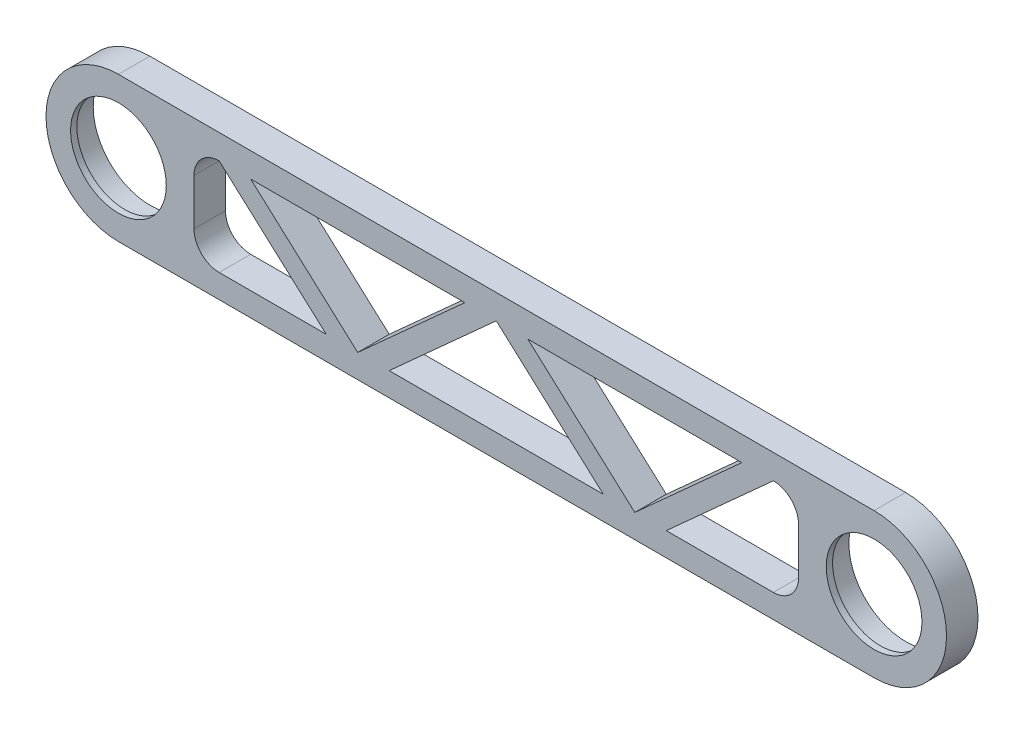
ISO-10303-21;
HEADER;
FILE_DESCRIPTION(('STEP AP214'),'2;1');
FILE_NAME('part.step','',(''),(''),'','','');
FILE_SCHEMA(('AUTOMOTIVE_DESIGN { 1 0 10303 214 1 1 1 1 }'));
ENDSEC;
DATA;
#1=APPLICATION_CONTEXT('core data for automotive mechanical design processes');
#2=APPLICATION_PROTOCOL_DEFINITION('international standard','automotive_design',2000,#1);
#3=PRODUCT_CONTEXT('',#1,'mechanical');
#4=PRODUCT('Part','Part','',(#3));
#5=PRODUCT_RELATED_PRODUCT_CATEGORY('part','',(#4));
#6=PRODUCT_DEFINITION_FORMATION('','',#4);
#7=PRODUCT_DEFINITION_CONTEXT('part definition',#1,'design');
#8=PRODUCT_DEFINITION('design','',#6,#7);
#9=PRODUCT_DEFINITION_SHAPE('','',#8);
#10=(LENGTH_UNIT() NAMED_UNIT(*) SI_UNIT(.MILLI.,.METRE.));
#11=(NAMED_UNIT(*) PLANE_ANGLE_UNIT() SI_UNIT($,.RADIAN.));
#12=(NAMED_UNIT(*) SI_UNIT($,.STERADIAN.) SOLID_ANGLE_UNIT());
#13=UNCERTAINTY_MEASURE_WITH_UNIT(LENGTH_MEASURE(1.E-05),#10,'distance_accuracy_value','');
#14=(GEOMETRIC_REPRESENTATION_CONTEXT(3) GLOBAL_UNCERTAINTY_ASSIGNED_CONTEXT((#13)) GLOBAL_UNIT_ASSIGNED_CONTEXT((#10,
#11,#12)) REPRESENTATION_CONTEXT('',''));
#15=CARTESIAN_POINT('',(0.,0.,0.));
#16=DIRECTION('',(0.,0.,1.));
#17=DIRECTION('',(1.,0.,0.));
#18=AXIS2_PLACEMENT_3D('',#15,#16,#17);
#19=CARTESIAN_POINT('',(0.,0.,5.));
#20=DIRECTION('',(0.,0.,1.));
#21=DIRECTION('',(1.,0.,0.));
#22=AXIS2_PLACEMENT_3D('',#19,#20,#21);
#23=PLANE('',#22);
#24=DIRECTION('',(0.742231284401253,0.670143805802954,0.));
#25=VECTOR('',#24,1.);
#26=CARTESIAN_POINT('',(40.6799264225191,-45.0558727492184,5.));
#27=LINE('',#26,#25);
#28=CARTESIAN_POINT('',(82.,-7.74891473597792,5.));
#29=VERTEX_POINT('',#28);
#30=CARTESIAN_POINT('',(99.,7.6,5.));
#31=VERTEX_POINT('',#30);
#32=EDGE_CURVE('E250',#29,#31,#27,.T.);
#33=ORIENTED_EDGE('',*,*,#32,.F.);
#34=DIRECTION('',(0.742231284401253,-0.670143805802954,0.));
#35=VECTOR('',#34,1.);
#36=CARTESIAN_POINT('',(32.9712797322758,36.5180056759874,5.));
#37=LINE('',#36,#35);
#38=CARTESIAN_POINT('',(65.,7.6,5.));
#39=VERTEX_POINT('',#38);
#40=EDGE_CURVE('E262',#39,#29,#37,.T.);
#41=ORIENTED_EDGE('',*,*,#40,.F.);
#42=DIRECTION('',(1.,0.,0.));
#43=VECTOR('',#42,1.);
#44=CARTESIAN_POINT('',(16.,7.6,5.));
#45=LINE('',#44,#43);
#46=EDGE_CURVE('E328',#39,#31,#45,.T.);
#47=ORIENTED_EDGE('',*,*,#46,.T.);
#48=EDGE_LOOP('',(#33,#41,#47));
#49=FACE_BOUND('',#48,.T.);
#50=DIRECTION('',(1.,0.,0.));
#51=VECTOR('',#50,1.);
#52=CARTESIAN_POINT('',(16.,-7.74891473597794,5.));
#53=LINE('',#52,#51);
#54=CARTESIAN_POINT('',(43.,-7.74891473597793,5.));
#55=VERTEX_POINT('',#54);
#56=CARTESIAN_POINT('',(77.,-7.74891473597793,5.));
#57=VERTEX_POINT('',#56);
#58=EDGE_CURVE('E325',#55,#57,#53,.T.);
#59=ORIENTED_EDGE('',*,*,#58,.F.);
#60=DIRECTION('',(0.742231284401253,0.670143805802954,0.));
#61=VECTOR('',#60,1.);
#62=CARTESIAN_POINT('',(23.1653103247325,-25.6572065383463,5.));
#63=LINE('',#62,#61);
#64=CARTESIAN_POINT('',(60.,7.6,5.));
#65=VERTEX_POINT('',#64);
#66=EDGE_CURVE('E291',#55,#65,#63,.T.);
#67=ORIENTED_EDGE('',*,*,#66,.T.);
#68=DIRECTION('',(0.742231284401253,-0.670143805802954,0.));
#69=VECTOR('',#68,1.);
#70=CARTESIAN_POINT('',(30.7258161299955,34.0309971874141,5.));
#71=LINE('',#70,#69);
#72=EDGE_CURVE('E272',#65,#57,#71,.T.);
#73=ORIENTED_EDGE('',*,*,#72,.T.);
#74=EDGE_LOOP('',(#59,#67,#73));
#75=FACE_BOUND('',#74,.T.);
#76=DIRECTION('',(0.742231284401253,-0.670143805802954,0.));
#77=VECTOR('',#76,1.);
#78=CARTESIAN_POINT('',(13.2112000322089,14.632330976542,5.));
#79=LINE('',#78,#77);
#80=CARTESIAN_POINT('',(21.,7.6,5.));
#81=VERTEX_POINT('',#80);
#82=CARTESIAN_POINT('',(38.,-7.74891473597793,5.));
#83=VERTEX_POINT('',#82);
#84=EDGE_CURVE('E303',#81,#83,#79,.T.);
#85=ORIENTED_EDGE('',*,*,#84,.F.);
#86=CARTESIAN_POINT('',(55.,7.6,5.));
#87=VERTEX_POINT('',#86);
#88=EDGE_CURVE('E329',#81,#87,#45,.T.);
#89=ORIENTED_EDGE('',*,*,#88,.T.);
#90=DIRECTION('',(0.742231284401253,0.670143805802954,0.));
#91=VECTOR('',#90,1.);
#92=CARTESIAN_POINT('',(20.9198467224522,-23.170198049773,5.));
#93=LINE('',#92,#91);
#94=EDGE_CURVE('E281',#83,#87,#93,.T.);
#95=ORIENTED_EDGE('',*,*,#94,.F.);
#96=EDGE_LOOP('',(#85,#89,#95));
#97=FACE_BOUND('',#96,.T.);
#98=CARTESIAN_POINT('',(16.,3.6,5.));
#99=DIRECTION('',(0.,0.,1.));
#100=DIRECTION('',(1.,0.,0.));
#101=AXIS2_PLACEMENT_3D('',#98,#99,#100);
#102=CIRCLE('',#101,4.);
#103=CARTESIAN_POINT('',(16.,7.6,5.));
#104=VERTEX_POINT('',#103);
#105=CARTESIAN_POINT('',(12.,3.6,5.));
#106=VERTEX_POINT('',#105);
#107=EDGE_CURVE('E312',#104,#106,#102,.T.);
#108=ORIENTED_EDGE('',*,*,#107,.F.);
#109=DIRECTION('',(0.742231284401253,-0.670143805802954,0.));
#110=VECTOR('',#109,1.);
#111=CARTESIAN_POINT('',(10.9657364299286,12.1453224879686,5.));
#112=LINE('',#111,#110);
#113=CARTESIAN_POINT('',(33.,-7.74891473597794,5.));
#114=VERTEX_POINT('',#113);
#115=EDGE_CURVE('E294',#104,#114,#112,.T.);
#116=ORIENTED_EDGE('',*,*,#115,.T.);
#117=CARTESIAN_POINT('',(16.,-7.74891473597794,5.));
#118=VERTEX_POINT('',#117);
#119=EDGE_CURVE('E326',#118,#114,#53,.T.);
#120=ORIENTED_EDGE('',*,*,#119,.F.);
#121=CARTESIAN_POINT('',(16.,-3.74891473597794,5.));
#122=DIRECTION('',(0.,0.,1.));
#123=DIRECTION('',(1.,0.,0.));
#124=AXIS2_PLACEMENT_3D('',#121,#122,#123);
#125=CIRCLE('',#124,4.);
#126=CARTESIAN_POINT('',(12.,-3.74891473597794,5.));
#127=VERTEX_POINT('',#126);
#128=EDGE_CURVE('E322',#127,#118,#125,.T.);
#129=ORIENTED_EDGE('',*,*,#128,.F.);
#130=DIRECTION('',(0.,-1.,0.));
#131=VECTOR('',#130,1.);
#132=CARTESIAN_POINT('',(12.,3.6,5.));
#133=LINE('',#132,#131);
#134=EDGE_CURVE('E319',#106,#127,#133,.T.);
#135=ORIENTED_EDGE('',*,*,#134,.F.);
#136=EDGE_LOOP('',(#108,#116,#120,#129,#135));
#137=FACE_BOUND('',#136,.T.);
#138=CARTESIAN_POINT('',(120.,0.,5.));
#139=DIRECTION('',(0.,0.,1.));
#140=DIRECTION('',(1.,0.,0.));
#141=AXIS2_PLACEMENT_3D('',#138,#139,#140);
#142=CIRCLE('',#141,7.60000000000001);
#143=CARTESIAN_POINT('',(127.6,0.,5.));
#144=VERTEX_POINT('',#143);
#145=EDGE_CURVE('E345',#144,#144,#142,.T.);
#146=ORIENTED_EDGE('',*,*,#145,.F.);
#147=EDGE_LOOP('',(#146));
#148=FACE_BOUND('',#147,.T.);
#149=CARTESIAN_POINT('',(0.,0.,5.));
#150=DIRECTION('',(0.,0.,1.));
#151=DIRECTION('',(1.,0.,0.));
#152=AXIS2_PLACEMENT_3D('',#149,#150,#151);
#153=CIRCLE('',#152,7.6);
#154=CARTESIAN_POINT('',(7.6,0.,5.));
#155=VERTEX_POINT('',#154);
#156=EDGE_CURVE('E355',#155,#155,#153,.T.);
#157=ORIENTED_EDGE('',*,*,#156,.F.);
#158=EDGE_LOOP('',(#157));
#159=FACE_BOUND('',#158,.T.);
#160=CARTESIAN_POINT('',(0.,0.,5.));
#161=DIRECTION('',(0.,0.,1.));
#162=DIRECTION('',(1.,0.,0.));
#163=AXIS2_PLACEMENT_3D('',#160,#161,#162);
#164=CIRCLE('',#163,11.5);
#165=CARTESIAN_POINT('',(0.,11.5,5.));
#166=VERTEX_POINT('',#165);
#167=CARTESIAN_POINT('',(0.,-11.5,5.));
#168=VERTEX_POINT('',#167);
#169=EDGE_CURVE('E363',#166,#168,#164,.T.);
#170=ORIENTED_EDGE('',*,*,#169,.T.);
#171=DIRECTION('',(1.,0.,0.));
#172=VECTOR('',#171,1.);
#173=CARTESIAN_POINT('',(0.,-11.5,5.));
#174=LINE('',#173,#172);
#175=CARTESIAN_POINT('',(120.,-11.5,5.));
#176=VERTEX_POINT('',#175);
#177=EDGE_CURVE('E366',#168,#176,#174,.T.);
#178=ORIENTED_EDGE('',*,*,#177,.T.);
#179=CARTESIAN_POINT('',(120.,0.,5.));
#180=DIRECTION('',(0.,0.,1.));
#181=DIRECTION('',(1.,0.,0.));
#182=AXIS2_PLACEMENT_3D('',#179,#180,#181);
#183=CIRCLE('',#182,11.5);
#184=CARTESIAN_POINT('',(120.,11.5,5.));
#185=VERTEX_POINT('',#184);
#186=EDGE_CURVE('E369',#176,#185,#183,.T.);
#187=ORIENTED_EDGE('',*,*,#186,.T.);
#188=DIRECTION('',(-1.,0.,0.));
#189=VECTOR('',#188,1.);
#190=CARTESIAN_POINT('',(0.,11.5,5.));
#191=LINE('',#190,#189);
#192=EDGE_CURVE('E371',#185,#166,#191,.T.);
#193=ORIENTED_EDGE('',*,*,#192,.T.);
#194=EDGE_LOOP('',(#170,#178,#187,#193));
#195=FACE_BOUND('',#194,.T.);
#196=DIRECTION('',(0.742231284401253,0.670143805802953,0.));
#197=VECTOR('',#196,1.);
#198=CARTESIAN_POINT('',(42.9253900247994,-47.5428812377918,5.));
#199=LINE('',#198,#197);
#200=CARTESIAN_POINT('',(87.,-7.74891473597792,5.));
#201=VERTEX_POINT('',#200);
#202=CARTESIAN_POINT('',(104.,7.59999999999998,5.));
#203=VERTEX_POINT('',#202);
#204=EDGE_CURVE('E235',#201,#203,#199,.T.);
#205=ORIENTED_EDGE('',*,*,#204,.T.);
#206=CARTESIAN_POINT('',(104.,3.6,5.));
#207=DIRECTION('',(0.,0.,1.));
#208=DIRECTION('',(1.,0.,0.));
#209=AXIS2_PLACEMENT_3D('',#206,#207,#208);
#210=CIRCLE('',#209,3.99999999999999);
#211=CARTESIAN_POINT('',(108.,3.6,5.));
#212=VERTEX_POINT('',#211);
#213=EDGE_CURVE('E84',#203,#212,#210,.F.);
#214=ORIENTED_EDGE('',*,*,#213,.T.);
#215=DIRECTION('',(0.,-1.,0.));
#216=VECTOR('',#215,1.);
#217=CARTESIAN_POINT('',(108.,0.,5.));
#218=LINE('',#217,#216);
#219=CARTESIAN_POINT('',(108.,-3.74891473597792,5.));
#220=VERTEX_POINT('',#219);
#221=EDGE_CURVE('E243',#212,#220,#218,.T.);
#222=ORIENTED_EDGE('',*,*,#221,.T.);
#223=CARTESIAN_POINT('',(104.,-3.74891473597792,5.));
#224=DIRECTION('',(0.,0.,1.));
#225=DIRECTION('',(1.,0.,0.));
#226=AXIS2_PLACEMENT_3D('',#223,#224,#225);
#227=CIRCLE('',#226,4.);
#228=CARTESIAN_POINT('',(104.,-7.74891473597792,5.));
#229=VERTEX_POINT('',#228);
#230=EDGE_CURVE('E241',#229,#220,#227,.T.);
#231=ORIENTED_EDGE('',*,*,#230,.F.);
#232=DIRECTION('',(1.,0.,0.));
#233=VECTOR('',#232,1.);
#234=CARTESIAN_POINT('',(0.,-7.74891473597795,5.));
#235=LINE('',#234,#233);
#236=EDGE_CURVE('E226',#201,#229,#235,.T.);
#237=ORIENTED_EDGE('',*,*,#236,.F.);
#238=EDGE_LOOP('',(#205,#214,#222,#231,#237));
#239=FACE_BOUND('',#238,.T.);
#240=ADVANCED_FACE('F69',(#49,#75,#97,#137,#148,#159,#195,#239),#23,.T.);
#241=CARTESIAN_POINT('',(0.,0.,0.));
#242=DIRECTION('',(0.,0.,1.));
#243=DIRECTION('',(1.,0.,0.));
#244=AXIS2_PLACEMENT_3D('',#241,#242,#243);
#245=PLANE('',#244);
#246=CARTESIAN_POINT('',(0.,0.,0.));
#247=DIRECTION('',(0.,0.,1.));
#248=DIRECTION('',(1.,0.,0.));
#249=AXIS2_PLACEMENT_3D('',#246,#247,#248);
#250=CIRCLE('',#249,11.5);
#251=CARTESIAN_POINT('',(0.,11.5,0.));
#252=VERTEX_POINT('',#251);
#253=CARTESIAN_POINT('',(0.,-11.5,0.));
#254=VERTEX_POINT('',#253);
#255=EDGE_CURVE('E359',#252,#254,#250,.T.);
#256=ORIENTED_EDGE('',*,*,#255,.F.);
#257=DIRECTION('',(-1.,0.,0.));
#258=VECTOR('',#257,1.);
#259=CARTESIAN_POINT('',(0.,11.5,0.));
#260=LINE('',#259,#258);
#261=CARTESIAN_POINT('',(120.,11.5,0.));
#262=VERTEX_POINT('',#261);
#263=EDGE_CURVE('E367',#262,#252,#260,.T.);
#264=ORIENTED_EDGE('',*,*,#263,.F.);
#265=CARTESIAN_POINT('',(120.,0.,0.));
#266=DIRECTION('',(0.,0.,1.));
#267=DIRECTION('',(1.,0.,0.));
#268=AXIS2_PLACEMENT_3D('',#265,#266,#267);
#269=CIRCLE('',#268,11.5);
#270=CARTESIAN_POINT('',(120.,-11.5,0.));
#271=VERTEX_POINT('',#270);
#272=EDGE_CURVE('E378',#271,#262,#269,.T.);
#273=ORIENTED_EDGE('',*,*,#272,.F.);
#274=DIRECTION('',(1.,0.,0.));
#275=VECTOR('',#274,1.);
#276=CARTESIAN_POINT('',(0.,-11.5,0.));
#277=LINE('',#276,#275);
#278=EDGE_CURVE('E376',#254,#271,#277,.T.);
#279=ORIENTED_EDGE('',*,*,#278,.F.);
#280=EDGE_LOOP('',(#256,#264,#273,#279));
#281=FACE_BOUND('',#280,.T.);
#282=CARTESIAN_POINT('',(0.,0.,0.));
#283=DIRECTION('',(0.,0.,-1.));
#284=DIRECTION('',(-1.,0.,0.));
#285=AXIS2_PLACEMENT_3D('',#282,#283,#284);
#286=CIRCLE('',#285,9.);
#287=CARTESIAN_POINT('',(-9.,0.,0.));
#288=VERTEX_POINT('',#287);
#289=EDGE_CURVE('E360',#288,#288,#286,.T.);
#290=ORIENTED_EDGE('',*,*,#289,.F.);
#291=EDGE_LOOP('',(#290));
#292=FACE_BOUND('',#291,.T.);
#293=CARTESIAN_POINT('',(120.,0.,0.));
#294=DIRECTION('',(0.,0.,-1.));
#295=DIRECTION('',(-1.,0.,0.));
#296=AXIS2_PLACEMENT_3D('',#293,#294,#295);
#297=CIRCLE('',#296,9.00000000000001);
#298=CARTESIAN_POINT('',(111.,0.,0.));
#299=VERTEX_POINT('',#298);
#300=EDGE_CURVE('E350',#299,#299,#297,.T.);
#301=ORIENTED_EDGE('',*,*,#300,.F.);
#302=EDGE_LOOP('',(#301));
#303=FACE_BOUND('',#302,.T.);
#304=DIRECTION('',(0.742231284401253,-0.670143805802954,0.));
#305=VECTOR('',#304,1.);
#306=CARTESIAN_POINT('',(10.9657364299286,12.1453224879686,0.));
#307=LINE('',#306,#305);
#308=CARTESIAN_POINT('',(16.,7.6,0.));
#309=VERTEX_POINT('',#308);
#310=CARTESIAN_POINT('',(33.,-7.74891473597794,0.));
#311=VERTEX_POINT('',#310);
#312=EDGE_CURVE('E299',#309,#311,#307,.T.);
#313=ORIENTED_EDGE('',*,*,#312,.F.);
#314=CARTESIAN_POINT('',(16.,3.6,0.));
#315=DIRECTION('',(0.,0.,1.));
#316=DIRECTION('',(1.,0.,0.));
#317=AXIS2_PLACEMENT_3D('',#314,#315,#316);
#318=CIRCLE('',#317,4.);
#319=CARTESIAN_POINT('',(12.,3.6,0.));
#320=VERTEX_POINT('',#319);
#321=EDGE_CURVE('E409',#309,#320,#318,.T.);
#322=ORIENTED_EDGE('',*,*,#321,.T.);
#323=DIRECTION('',(0.,-1.,0.));
#324=VECTOR('',#323,1.);
#325=CARTESIAN_POINT('',(12.,0.,0.));
#326=LINE('',#325,#324);
#327=CARTESIAN_POINT('',(12.,-3.74891473597794,0.));
#328=VERTEX_POINT('',#327);
#329=EDGE_CURVE('E392',#320,#328,#326,.T.);
#330=ORIENTED_EDGE('',*,*,#329,.T.);
#331=CARTESIAN_POINT('',(16.,-3.74891473597794,0.));
#332=DIRECTION('',(0.,0.,1.));
#333=DIRECTION('',(1.,0.,0.));
#334=AXIS2_PLACEMENT_3D('',#331,#332,#333);
#335=CIRCLE('',#334,4.);
#336=CARTESIAN_POINT('',(16.,-7.74891473597794,0.));
#337=VERTEX_POINT('',#336);
#338=EDGE_CURVE('E399',#328,#337,#335,.T.);
#339=ORIENTED_EDGE('',*,*,#338,.T.);
#340=DIRECTION('',(1.,0.,0.));
#341=VECTOR('',#340,1.);
#342=CARTESIAN_POINT('',(0.,-7.74891473597795,0.));
#343=LINE('',#342,#341);
#344=EDGE_CURVE('E403',#337,#311,#343,.T.);
#345=ORIENTED_EDGE('',*,*,#344,.T.);
#346=EDGE_LOOP('',(#313,#322,#330,#339,#345));
#347=FACE_BOUND('',#346,.T.);
#348=DIRECTION('',(1.,0.,0.));
#349=VECTOR('',#348,1.);
#350=CARTESIAN_POINT('',(0.,7.6,0.));
#351=LINE('',#350,#349);
#352=CARTESIAN_POINT('',(21.,7.6,0.));
#353=VERTEX_POINT('',#352);
#354=CARTESIAN_POINT('',(55.,7.6,0.));
#355=VERTEX_POINT('',#354);
#356=EDGE_CURVE('E407',#353,#355,#351,.T.);
#357=ORIENTED_EDGE('',*,*,#356,.F.);
#358=DIRECTION('',(0.742231284401253,-0.670143805802954,0.));
#359=VECTOR('',#358,1.);
#360=CARTESIAN_POINT('',(13.2112000322089,14.632330976542,0.));
#361=LINE('',#360,#359);
#362=CARTESIAN_POINT('',(38.,-7.74891473597794,0.));
#363=VERTEX_POINT('',#362);
#364=EDGE_CURVE('E302',#353,#363,#361,.T.);
#365=ORIENTED_EDGE('',*,*,#364,.T.);
#366=DIRECTION('',(0.742231284401253,0.670143805802954,0.));
#367=VECTOR('',#366,1.);
#368=CARTESIAN_POINT('',(20.9198467224522,-23.170198049773,0.));
#369=LINE('',#368,#367);
#370=EDGE_CURVE('E285',#363,#355,#369,.T.);
#371=ORIENTED_EDGE('',*,*,#370,.T.);
#372=EDGE_LOOP('',(#357,#365,#371));
#373=FACE_BOUND('',#372,.T.);
#374=DIRECTION('',(0.742231284401253,0.670143805802954,0.));
#375=VECTOR('',#374,1.);
#376=CARTESIAN_POINT('',(23.1653103247325,-25.6572065383463,0.));
#377=LINE('',#376,#375);
#378=CARTESIAN_POINT('',(43.,-7.74891473597793,0.));
#379=VERTEX_POINT('',#378);
#380=CARTESIAN_POINT('',(60.,7.6,0.));
#381=VERTEX_POINT('',#380);
#382=EDGE_CURVE('E286',#379,#381,#377,.T.);
#383=ORIENTED_EDGE('',*,*,#382,.F.);
#384=CARTESIAN_POINT('',(77.,-7.74891473597793,0.));
#385=VERTEX_POINT('',#384);
#386=EDGE_CURVE('E402',#379,#385,#343,.T.);
#387=ORIENTED_EDGE('',*,*,#386,.T.);
#388=DIRECTION('',(0.742231284401253,-0.670143805802954,0.));
#389=VECTOR('',#388,1.);
#390=CARTESIAN_POINT('',(30.7258161299955,34.0309971874141,0.));
#391=LINE('',#390,#389);
#392=EDGE_CURVE('E269',#381,#385,#391,.T.);
#393=ORIENTED_EDGE('',*,*,#392,.F.);
#394=EDGE_LOOP('',(#383,#387,#393));
#395=FACE_BOUND('',#394,.T.);
#396=DIRECTION('',(0.742231284401253,-0.670143805802954,0.));
#397=VECTOR('',#396,1.);
#398=CARTESIAN_POINT('',(32.9712797322758,36.5180056759874,0.));
#399=LINE('',#398,#397);
#400=CARTESIAN_POINT('',(65.,7.6,0.));
#401=VERTEX_POINT('',#400);
#402=CARTESIAN_POINT('',(82.,-7.74891473597792,0.));
#403=VERTEX_POINT('',#402);
#404=EDGE_CURVE('E268',#401,#403,#399,.T.);
#405=ORIENTED_EDGE('',*,*,#404,.T.);
#406=DIRECTION('',(0.742231284401253,0.670143805802954,0.));
#407=VECTOR('',#406,1.);
#408=CARTESIAN_POINT('',(40.6799264225191,-45.0558727492184,0.));
#409=LINE('',#408,#407);
#410=CARTESIAN_POINT('',(99.,7.6,0.));
#411=VERTEX_POINT('',#410);
#412=EDGE_CURVE('E257',#403,#411,#409,.T.);
#413=ORIENTED_EDGE('',*,*,#412,.T.);
#414=EDGE_CURVE('E406',#401,#411,#351,.T.);
#415=ORIENTED_EDGE('',*,*,#414,.F.);
#416=EDGE_LOOP('',(#405,#413,#415));
#417=FACE_BOUND('',#416,.T.);
#418=CARTESIAN_POINT('',(104.,3.6,0.));
#419=DIRECTION('',(0.,0.,1.));
#420=DIRECTION('',(1.,0.,0.));
#421=AXIS2_PLACEMENT_3D('',#418,#419,#420);
#422=CIRCLE('',#421,3.99999999999999);
#423=CARTESIAN_POINT('',(104.,7.6,0.));
#424=VERTEX_POINT('',#423);
#425=CARTESIAN_POINT('',(108.,3.6,0.));
#426=VERTEX_POINT('',#425);
#427=EDGE_CURVE('E12',#424,#426,#422,.F.);
#428=ORIENTED_EDGE('',*,*,#427,.F.);
#429=DIRECTION('',(0.742231284401253,0.670143805802953,0.));
#430=VECTOR('',#429,1.);
#431=CARTESIAN_POINT('',(42.9253900247994,-47.5428812377918,0.));
#432=LINE('',#431,#430);
#433=CARTESIAN_POINT('',(87.,-7.74891473597792,0.));
#434=VERTEX_POINT('',#433);
#435=EDGE_CURVE('E412',#434,#424,#432,.T.);
#436=ORIENTED_EDGE('',*,*,#435,.F.);
#437=DIRECTION('',(1.,0.,0.));
#438=VECTOR('',#437,1.);
#439=CARTESIAN_POINT('',(0.,-7.74891473597795,0.));
#440=LINE('',#439,#438);
#441=CARTESIAN_POINT('',(104.,-7.74891473597792,0.));
#442=VERTEX_POINT('',#441);
#443=EDGE_CURVE('E229',#434,#442,#440,.T.);
#444=ORIENTED_EDGE('',*,*,#443,.T.);
#445=CARTESIAN_POINT('',(104.,-3.74891473597792,0.));
#446=DIRECTION('',(0.,0.,1.));
#447=DIRECTION('',(1.,0.,0.));
#448=AXIS2_PLACEMENT_3D('',#445,#446,#447);
#449=CIRCLE('',#448,4.);
#450=CARTESIAN_POINT('',(108.,-3.74891473597792,0.));
#451=VERTEX_POINT('',#450);
#452=EDGE_CURVE('E415',#442,#451,#449,.T.);
#453=ORIENTED_EDGE('',*,*,#452,.T.);
#454=DIRECTION('',(0.,-1.,0.));
#455=VECTOR('',#454,1.);
#456=CARTESIAN_POINT('',(108.,0.,0.));
#457=LINE('',#456,#455);
#458=EDGE_CURVE('E77',#426,#451,#457,.T.);
#459=ORIENTED_EDGE('',*,*,#458,.F.);
#460=EDGE_LOOP('',(#428,#436,#444,#453,#459));
#461=FACE_BOUND('',#460,.T.);
#462=ADVANCED_FACE('F427',(#281,#292,#303,#347,#373,#395,#417,#461),#245,.F.);
#463=CARTESIAN_POINT('',(16.,7.6,-15.));
#464=DIRECTION('',(0.,-1.,0.));
#465=DIRECTION('',(0.,0.,-1.));
#466=AXIS2_PLACEMENT_3D('',#463,#464,#465);
#467=PLANE('',#466);
#468=ORIENTED_EDGE('',*,*,#414,.T.);
#469=DIRECTION('',(0.,0.,1.));
#470=VECTOR('',#469,1.);
#471=CARTESIAN_POINT('',(99.,7.6,0.));
#472=LINE('',#471,#470);
#473=EDGE_CURVE('E255',#411,#31,#472,.T.);
#474=ORIENTED_EDGE('',*,*,#473,.T.);
#475=ORIENTED_EDGE('',*,*,#46,.F.);
#476=DIRECTION('',(0.,0.,1.));
#477=VECTOR('',#476,1.);
#478=CARTESIAN_POINT('',(65.,7.6,0.));
#479=LINE('',#478,#477);
#480=EDGE_CURVE('E263',#401,#39,#479,.T.);
#481=ORIENTED_EDGE('',*,*,#480,.F.);
#482=EDGE_LOOP('',(#468,#474,#475,#481));
#483=FACE_BOUND('',#482,.T.);
#484=ADVANCED_FACE('F447',(#483),#467,.T.);
#485=ORIENTED_EDGE('',*,*,#356,.T.);
#486=DIRECTION('',(0.,0.,1.));
#487=VECTOR('',#486,1.);
#488=CARTESIAN_POINT('',(55.,7.6,0.));
#489=LINE('',#488,#487);
#490=EDGE_CURVE('E287',#355,#87,#489,.T.);
#491=ORIENTED_EDGE('',*,*,#490,.T.);
#492=ORIENTED_EDGE('',*,*,#88,.F.);
#493=DIRECTION('',(0.,0.,1.));
#494=VECTOR('',#493,1.);
#495=CARTESIAN_POINT('',(21.,7.6,0.));
#496=LINE('',#495,#494);
#497=EDGE_CURVE('E309',#353,#81,#496,.T.);
#498=ORIENTED_EDGE('',*,*,#497,.F.);
#499=EDGE_LOOP('',(#485,#491,#492,#498));
#500=FACE_BOUND('',#499,.T.);
#501=ADVANCED_FACE('F533',(#500),#467,.T.);
#502=CARTESIAN_POINT('',(16.,-7.74891473597794,-15.));
#503=DIRECTION('',(0.,-1.,0.));
#504=DIRECTION('',(1.,0.,0.));
#505=AXIS2_PLACEMENT_3D('',#502,#503,#504);
#506=PLANE('',#505);
#507=ORIENTED_EDGE('',*,*,#58,.T.);
#508=DIRECTION('',(0.,0.,1.));
#509=VECTOR('',#508,1.);
#510=CARTESIAN_POINT('',(77.,-7.74891473597793,0.));
#511=LINE('',#510,#509);
#512=EDGE_CURVE('E266',#385,#57,#511,.T.);
#513=ORIENTED_EDGE('',*,*,#512,.F.);
#514=ORIENTED_EDGE('',*,*,#386,.F.);
#515=DIRECTION('',(0.,0.,1.));
#516=VECTOR('',#515,1.);
#517=CARTESIAN_POINT('',(43.,-7.74891473597793,0.));
#518=LINE('',#517,#516);
#519=EDGE_CURVE('E275',#379,#55,#518,.T.);
#520=ORIENTED_EDGE('',*,*,#519,.T.);
#521=EDGE_LOOP('',(#507,#513,#514,#520));
#522=FACE_BOUND('',#521,.T.);
#523=ADVANCED_FACE('F469',(#522),#506,.F.);
#524=CARTESIAN_POINT('',(0.,0.,5.));
#525=DIRECTION('',(0.,0.,-1.));
#526=DIRECTION('',(-1.,0.,0.));
#527=AXIS2_PLACEMENT_3D('',#524,#525,#526);
#528=CYLINDRICAL_SURFACE('',#527,11.5);
#529=ORIENTED_EDGE('',*,*,#255,.T.);
#530=DIRECTION('',(0.,0.,-1.));
#531=VECTOR('',#530,1.);
#532=CARTESIAN_POINT('',(0.,-11.5,5.));
#533=LINE('',#532,#531);
#534=EDGE_CURVE('E389',#168,#254,#533,.T.);
#535=ORIENTED_EDGE('',*,*,#534,.F.);
#536=ORIENTED_EDGE('',*,*,#169,.F.);
#537=DIRECTION('',(0.,0.,-1.));
#538=VECTOR('',#537,1.);
#539=CARTESIAN_POINT('',(0.,11.5,5.));
#540=LINE('',#539,#538);
#541=EDGE_CURVE('E373',#166,#252,#540,.T.);
#542=ORIENTED_EDGE('',*,*,#541,.T.);
#543=EDGE_LOOP('',(#529,#535,#536,#542));
#544=FACE_BOUND('',#543,.T.);
#545=ADVANCED_FACE('F71',(#544),#528,.T.);
#546=CARTESIAN_POINT('',(0.,-11.5,5.));
#547=DIRECTION('',(0.,1.,0.));
#548=DIRECTION('',(0.,0.,1.));
#549=AXIS2_PLACEMENT_3D('',#546,#547,#548);
#550=PLANE('',#549);
#551=ORIENTED_EDGE('',*,*,#278,.T.);
#552=DIRECTION('',(0.,0.,-1.));
#553=VECTOR('',#552,1.);
#554=CARTESIAN_POINT('',(120.,-11.5,5.));
#555=LINE('',#554,#553);
#556=EDGE_CURVE('E386',#176,#271,#555,.T.);
#557=ORIENTED_EDGE('',*,*,#556,.F.);
#558=ORIENTED_EDGE('',*,*,#177,.F.);
#559=ORIENTED_EDGE('',*,*,#534,.T.);
#560=EDGE_LOOP('',(#551,#557,#558,#559));
#561=FACE_BOUND('',#560,.T.);
#562=ADVANCED_FACE('F462',(#561),#550,.F.);
#563=CARTESIAN_POINT('',(120.,0.,5.));
#564=DIRECTION('',(0.,0.,-1.));
#565=DIRECTION('',(-1.,0.,0.));
#566=AXIS2_PLACEMENT_3D('',#563,#564,#565);
#567=CYLINDRICAL_SURFACE('',#566,11.5);
#568=ORIENTED_EDGE('',*,*,#272,.T.);
#569=DIRECTION('',(0.,0.,-1.));
#570=VECTOR('',#569,1.);
#571=CARTESIAN_POINT('',(120.,11.5,5.));
#572=LINE('',#571,#570);
#573=EDGE_CURVE('E383',#185,#262,#572,.T.);
#574=ORIENTED_EDGE('',*,*,#573,.F.);
#575=ORIENTED_EDGE('',*,*,#186,.F.);
#576=ORIENTED_EDGE('',*,*,#556,.T.);
#577=EDGE_LOOP('',(#568,#574,#575,#576));
#578=FACE_BOUND('',#577,.T.);
#579=ADVANCED_FACE('F459',(#578),#567,.T.);
#580=CARTESIAN_POINT('',(0.,11.5,5.));
#581=DIRECTION('',(0.,-1.,0.));
#582=DIRECTION('',(0.,0.,-1.));
#583=AXIS2_PLACEMENT_3D('',#580,#581,#582);
#584=PLANE('',#583);
#585=ORIENTED_EDGE('',*,*,#263,.T.);
#586=ORIENTED_EDGE('',*,*,#541,.F.);
#587=ORIENTED_EDGE('',*,*,#192,.F.);
#588=ORIENTED_EDGE('',*,*,#573,.T.);
#589=EDGE_LOOP('',(#585,#586,#587,#588));
#590=FACE_BOUND('',#589,.T.);
#591=ADVANCED_FACE('F456',(#590),#584,.F.);
#592=CARTESIAN_POINT('',(0.,0.,4.));
#593=DIRECTION('',(0.,0.,-1.));
#594=DIRECTION('',(-1.,0.,0.));
#595=AXIS2_PLACEMENT_3D('',#592,#593,#594);
#596=CYLINDRICAL_SURFACE('',#595,9.);
#597=CARTESIAN_POINT('',(0.,0.,4.));
#598=DIRECTION('',(0.,0.,-1.));
#599=DIRECTION('',(-1.,0.,0.));
#600=AXIS2_PLACEMENT_3D('',#597,#598,#599);
#601=CIRCLE('',#600,9.);
#602=CARTESIAN_POINT('',(-9.,0.,4.));
#603=VERTEX_POINT('',#602);
#604=EDGE_CURVE('E356',#603,#603,#601,.T.);
#605=ORIENTED_EDGE('',*,*,#604,.F.);
#606=EDGE_LOOP('',(#605));
#607=FACE_BOUND('',#606,.T.);
#608=ORIENTED_EDGE('',*,*,#289,.T.);
#609=EDGE_LOOP('',(#608));
#610=FACE_BOUND('',#609,.T.);
#611=ADVANCED_FACE('F453',(#607,#610),#596,.F.);
#612=CARTESIAN_POINT('',(0.,0.,4.));
#613=DIRECTION('',(0.,0.,-1.));
#614=DIRECTION('',(-1.,0.,0.));
#615=AXIS2_PLACEMENT_3D('',#612,#613,#614);
#616=PLANE('',#615);
#617=CARTESIAN_POINT('',(0.,0.,4.));
#618=DIRECTION('',(0.,0.,-1.));
#619=DIRECTION('',(-1.,0.,0.));
#620=AXIS2_PLACEMENT_3D('',#617,#618,#619);
#621=CIRCLE('',#620,7.6);
#622=CARTESIAN_POINT('',(-7.6,0.,4.));
#623=VERTEX_POINT('',#622);
#624=EDGE_CURVE('E349',#623,#623,#621,.T.);
#625=ORIENTED_EDGE('',*,*,#624,.F.);
#626=EDGE_LOOP('',(#625));
#627=FACE_BOUND('',#626,.T.);
#628=ORIENTED_EDGE('',*,*,#604,.T.);
#629=EDGE_LOOP('',(#628));
#630=FACE_BOUND('',#629,.T.);
#631=ADVANCED_FACE('F563',(#627,#630),#616,.T.);
#632=CARTESIAN_POINT('',(0.,0.,6.89113645110868));
#633=DIRECTION('',(0.,0.,-1.));
#634=DIRECTION('',(-1.,0.,0.));
#635=AXIS2_PLACEMENT_3D('',#632,#633,#634);
#636=CYLINDRICAL_SURFACE('',#635,7.6);
#637=ORIENTED_EDGE('',*,*,#156,.T.);
#638=EDGE_LOOP('',(#637));
#639=FACE_BOUND('',#638,.T.);
#640=ORIENTED_EDGE('',*,*,#624,.T.);
#641=EDGE_LOOP('',(#640));
#642=FACE_BOUND('',#641,.T.);
#643=ADVANCED_FACE('F560',(#639,#642),#636,.F.);
#644=CARTESIAN_POINT('',(120.,0.,4.));
#645=DIRECTION('',(0.,0.,-1.));
#646=DIRECTION('',(-1.,0.,0.));
#647=AXIS2_PLACEMENT_3D('',#644,#645,#646);
#648=CYLINDRICAL_SURFACE('',#647,9.00000000000001);
#649=CARTESIAN_POINT('',(120.,0.,4.));
#650=DIRECTION('',(0.,0.,-1.));
#651=DIRECTION('',(-1.,0.,0.));
#652=AXIS2_PLACEMENT_3D('',#649,#650,#651);
#653=CIRCLE('',#652,9.00000000000001);
#654=CARTESIAN_POINT('',(111.,0.,4.));
#655=VERTEX_POINT('',#654);
#656=EDGE_CURVE('E346',#655,#655,#653,.T.);
#657=ORIENTED_EDGE('',*,*,#656,.F.);
#658=EDGE_LOOP('',(#657));
#659=FACE_BOUND('',#658,.T.);
#660=ORIENTED_EDGE('',*,*,#300,.T.);
#661=EDGE_LOOP('',(#660));
#662=FACE_BOUND('',#661,.T.);
#663=ADVANCED_FACE('F556',(#659,#662),#648,.F.);
#664=CARTESIAN_POINT('',(120.,0.,4.));
#665=DIRECTION('',(0.,0.,-1.));
#666=DIRECTION('',(-1.,0.,0.));
#667=AXIS2_PLACEMENT_3D('',#664,#665,#666);
#668=PLANE('',#667);
#669=CARTESIAN_POINT('',(120.,0.,4.));
#670=DIRECTION('',(0.,0.,-1.));
#671=DIRECTION('',(-1.,0.,0.));
#672=AXIS2_PLACEMENT_3D('',#669,#670,#671);
#673=CIRCLE('',#672,7.60000000000001);
#674=CARTESIAN_POINT('',(112.4,0.,4.));
#675=VERTEX_POINT('',#674);
#676=EDGE_CURVE('E336',#675,#675,#673,.T.);
#677=ORIENTED_EDGE('',*,*,#676,.F.);
#678=EDGE_LOOP('',(#677));
#679=FACE_BOUND('',#678,.T.);
#680=ORIENTED_EDGE('',*,*,#656,.T.);
#681=EDGE_LOOP('',(#680));
#682=FACE_BOUND('',#681,.T.);
#683=ADVANCED_FACE('F552',(#679,#682),#668,.T.);
#684=CARTESIAN_POINT('',(120.,0.,10.4550914708562));
#685=DIRECTION('',(0.,0.,-1.));
#686=DIRECTION('',(-1.,0.,0.));
#687=AXIS2_PLACEMENT_3D('',#684,#685,#686);
#688=CYLINDRICAL_SURFACE('',#687,7.60000000000001);
#689=ORIENTED_EDGE('',*,*,#145,.T.);
#690=EDGE_LOOP('',(#689));
#691=FACE_BOUND('',#690,.T.);
#692=ORIENTED_EDGE('',*,*,#676,.T.);
#693=EDGE_LOOP('',(#692));
#694=FACE_BOUND('',#693,.T.);
#695=ADVANCED_FACE('F548',(#691,#694),#688,.F.);
#696=CARTESIAN_POINT('',(16.,3.6,-15.));
#697=DIRECTION('',(0.,0.,1.));
#698=DIRECTION('',(1.,0.,0.));
#699=AXIS2_PLACEMENT_3D('',#696,#697,#698);
#700=CYLINDRICAL_SURFACE('',#699,4.);
#701=DIRECTION('',(0.,0.,1.));
#702=VECTOR('',#701,1.);
#703=CARTESIAN_POINT('',(16.,7.6,-15.));
#704=LINE('',#703,#702);
#705=EDGE_CURVE('E333',#309,#104,#704,.T.);
#706=ORIENTED_EDGE('',*,*,#705,.T.);
#707=ORIENTED_EDGE('',*,*,#107,.T.);
#708=DIRECTION('',(0.,0.,1.));
#709=VECTOR('',#708,1.);
#710=CARTESIAN_POINT('',(12.,3.6,-15.));
#711=LINE('',#710,#709);
#712=EDGE_CURVE('E332',#320,#106,#711,.T.);
#713=ORIENTED_EDGE('',*,*,#712,.F.);
#714=ORIENTED_EDGE('',*,*,#321,.F.);
#715=EDGE_LOOP('',(#706,#707,#713,#714));
#716=FACE_BOUND('',#715,.T.);
#717=ADVANCED_FACE('F538',(#716),#700,.F.);
#718=ORIENTED_EDGE('',*,*,#119,.T.);
#719=DIRECTION('',(0.,0.,1.));
#720=VECTOR('',#719,1.);
#721=CARTESIAN_POINT('',(33.,-7.74891473597793,0.));
#722=LINE('',#721,#720);
#723=EDGE_CURVE('E305',#311,#114,#722,.T.);
#724=ORIENTED_EDGE('',*,*,#723,.F.);
#725=ORIENTED_EDGE('',*,*,#344,.F.);
#726=DIRECTION('',(0.,0.,1.));
#727=VECTOR('',#726,1.);
#728=CARTESIAN_POINT('',(16.,-7.74891473597794,-15.));
#729=LINE('',#728,#727);
#730=EDGE_CURVE('E337',#337,#118,#729,.T.);
#731=ORIENTED_EDGE('',*,*,#730,.T.);
#732=EDGE_LOOP('',(#718,#724,#725,#731));
#733=FACE_BOUND('',#732,.T.);
#734=ADVANCED_FACE('F534',(#733),#506,.F.);
#735=CARTESIAN_POINT('',(16.,-3.74891473597794,-15.));
#736=DIRECTION('',(0.,0.,1.));
#737=DIRECTION('',(1.,0.,0.));
#738=AXIS2_PLACEMENT_3D('',#735,#736,#737);
#739=CYLINDRICAL_SURFACE('',#738,4.);
#740=DIRECTION('',(0.,0.,1.));
#741=VECTOR('',#740,1.);
#742=CARTESIAN_POINT('',(12.,-3.74891473597794,-15.));
#743=LINE('',#742,#741);
#744=EDGE_CURVE('E339',#328,#127,#743,.T.);
#745=ORIENTED_EDGE('',*,*,#744,.T.);
#746=ORIENTED_EDGE('',*,*,#128,.T.);
#747=ORIENTED_EDGE('',*,*,#730,.F.);
#748=ORIENTED_EDGE('',*,*,#338,.F.);
#749=EDGE_LOOP('',(#745,#746,#747,#748));
#750=FACE_BOUND('',#749,.T.);
#751=ADVANCED_FACE('F537',(#750),#739,.F.);
#752=CARTESIAN_POINT('',(12.,3.6,-15.));
#753=DIRECTION('',(-1.,0.,0.));
#754=DIRECTION('',(0.,0.,1.));
#755=AXIS2_PLACEMENT_3D('',#752,#753,#754);
#756=PLANE('',#755);
#757=ORIENTED_EDGE('',*,*,#712,.T.);
#758=ORIENTED_EDGE('',*,*,#134,.T.);
#759=ORIENTED_EDGE('',*,*,#744,.F.);
#760=ORIENTED_EDGE('',*,*,#329,.F.);
#761=EDGE_LOOP('',(#757,#758,#759,#760));
#762=FACE_BOUND('',#761,.T.);
#763=ADVANCED_FACE('F526',(#762),#756,.F.);
#764=CARTESIAN_POINT('',(13.2112000322089,14.632330976542,0.));
#765=DIRECTION('',(-0.670143805802954,-0.742231284401253,0.));
#766=DIRECTION('',(0.742231284401253,-0.670143805802954,0.));
#767=AXIS2_PLACEMENT_3D('',#764,#765,#766);
#768=PLANE('',#767);
#769=ORIENTED_EDGE('',*,*,#84,.T.);
#770=DIRECTION('',(0.,0.,1.));
#771=VECTOR('',#770,1.);
#772=CARTESIAN_POINT('',(38.,-7.74891473597793,0.));
#773=LINE('',#772,#771);
#774=EDGE_CURVE('E313',#363,#83,#773,.T.);
#775=ORIENTED_EDGE('',*,*,#774,.F.);
#776=ORIENTED_EDGE('',*,*,#364,.F.);
#777=ORIENTED_EDGE('',*,*,#497,.T.);
#778=EDGE_LOOP('',(#769,#775,#776,#777));
#779=FACE_BOUND('',#778,.T.);
#780=ADVANCED_FACE('F523',(#779),#768,.F.);
#781=CARTESIAN_POINT('',(10.9657364299286,12.1453224879686,0.));
#782=DIRECTION('',(-0.670143805802954,-0.742231284401253,0.));
#783=DIRECTION('',(0.742231284401253,-0.670143805802954,0.));
#784=AXIS2_PLACEMENT_3D('',#781,#782,#783);
#785=PLANE('',#784);
#786=ORIENTED_EDGE('',*,*,#115,.F.);
#787=ORIENTED_EDGE('',*,*,#705,.F.);
#788=ORIENTED_EDGE('',*,*,#312,.T.);
#789=ORIENTED_EDGE('',*,*,#723,.T.);
#790=EDGE_LOOP('',(#786,#787,#788,#789));
#791=FACE_BOUND('',#790,.T.);
#792=ADVANCED_FACE('F521',(#791),#785,.T.);
#793=CARTESIAN_POINT('',(20.9198467224522,-23.170198049773,0.));
#794=DIRECTION('',(0.670143805802954,-0.742231284401253,0.));
#795=DIRECTION('',(0.742231284401253,0.670143805802954,0.));
#796=AXIS2_PLACEMENT_3D('',#793,#794,#795);
#797=PLANE('',#796);
#798=ORIENTED_EDGE('',*,*,#94,.T.);
#799=ORIENTED_EDGE('',*,*,#490,.F.);
#800=ORIENTED_EDGE('',*,*,#370,.F.);
#801=ORIENTED_EDGE('',*,*,#774,.T.);
#802=EDGE_LOOP('',(#798,#799,#800,#801));
#803=FACE_BOUND('',#802,.T.);
#804=ADVANCED_FACE('F515',(#803),#797,.F.);
#805=CARTESIAN_POINT('',(23.1653103247325,-25.6572065383463,0.));
#806=DIRECTION('',(0.670143805802954,-0.742231284401253,0.));
#807=DIRECTION('',(0.742231284401253,0.670143805802954,0.));
#808=AXIS2_PLACEMENT_3D('',#805,#806,#807);
#809=PLANE('',#808);
#810=ORIENTED_EDGE('',*,*,#66,.F.);
#811=ORIENTED_EDGE('',*,*,#519,.F.);
#812=ORIENTED_EDGE('',*,*,#382,.T.);
#813=DIRECTION('',(0.,0.,1.));
#814=VECTOR('',#813,1.);
#815=CARTESIAN_POINT('',(60.,7.6,0.));
#816=LINE('',#815,#814);
#817=EDGE_CURVE('E282',#381,#65,#816,.T.);
#818=ORIENTED_EDGE('',*,*,#817,.T.);
#819=EDGE_LOOP('',(#810,#811,#812,#818));
#820=FACE_BOUND('',#819,.T.);
#821=ADVANCED_FACE('F507',(#820),#809,.T.);
#822=CARTESIAN_POINT('',(32.9712797322758,36.5180056759874,0.));
#823=DIRECTION('',(-0.670143805802954,-0.742231284401253,0.));
#824=DIRECTION('',(0.742231284401253,-0.670143805802954,0.));
#825=AXIS2_PLACEMENT_3D('',#822,#823,#824);
#826=PLANE('',#825);
#827=ORIENTED_EDGE('',*,*,#40,.T.);
#828=DIRECTION('',(0.,0.,1.));
#829=VECTOR('',#828,1.);
#830=CARTESIAN_POINT('',(82.,-7.74891473597792,0.));
#831=LINE('',#830,#829);
#832=EDGE_CURVE('E265',#403,#29,#831,.T.);
#833=ORIENTED_EDGE('',*,*,#832,.F.);
#834=ORIENTED_EDGE('',*,*,#404,.F.);
#835=ORIENTED_EDGE('',*,*,#480,.T.);
#836=EDGE_LOOP('',(#827,#833,#834,#835));
#837=FACE_BOUND('',#836,.T.);
#838=ADVANCED_FACE('F505',(#837),#826,.F.);
#839=CARTESIAN_POINT('',(30.7258161299955,34.0309971874141,0.));
#840=DIRECTION('',(-0.670143805802954,-0.742231284401253,0.));
#841=DIRECTION('',(0.742231284401253,-0.670143805802954,0.));
#842=AXIS2_PLACEMENT_3D('',#839,#840,#841);
#843=PLANE('',#842);
#844=ORIENTED_EDGE('',*,*,#72,.F.);
#845=ORIENTED_EDGE('',*,*,#817,.F.);
#846=ORIENTED_EDGE('',*,*,#392,.T.);
#847=ORIENTED_EDGE('',*,*,#512,.T.);
#848=EDGE_LOOP('',(#844,#845,#846,#847));
#849=FACE_BOUND('',#848,.T.);
#850=ADVANCED_FACE('F438',(#849),#843,.T.);
#851=CARTESIAN_POINT('',(40.6799264225191,-45.0558727492184,0.));
#852=DIRECTION('',(0.670143805802954,-0.742231284401253,0.));
#853=DIRECTION('',(0.742231284401253,0.670143805802954,0.));
#854=AXIS2_PLACEMENT_3D('',#851,#852,#853);
#855=PLANE('',#854);
#856=ORIENTED_EDGE('',*,*,#32,.T.);
#857=ORIENTED_EDGE('',*,*,#473,.F.);
#858=ORIENTED_EDGE('',*,*,#412,.F.);
#859=ORIENTED_EDGE('',*,*,#832,.T.);
#860=EDGE_LOOP('',(#856,#857,#858,#859));
#861=FACE_BOUND('',#860,.T.);
#862=ADVANCED_FACE('F430',(#861),#855,.F.);
#863=CARTESIAN_POINT('',(104.,3.6,-5.));
#864=DIRECTION('',(0.,0.,1.));
#865=DIRECTION('',(1.,0.,0.));
#866=AXIS2_PLACEMENT_3D('',#863,#864,#865);
#867=CYLINDRICAL_SURFACE('',#866,3.99999999999999);
#868=ORIENTED_EDGE('',*,*,#427,.T.);
#869=DIRECTION('',(0.,0.,1.));
#870=VECTOR('',#869,1.);
#871=CARTESIAN_POINT('',(108.,3.6,-5.));
#872=LINE('',#871,#870);
#873=EDGE_CURVE('E248',#426,#212,#872,.T.);
#874=ORIENTED_EDGE('',*,*,#873,.T.);
#875=ORIENTED_EDGE('',*,*,#213,.F.);
#876=DIRECTION('',(0.,0.,1.));
#877=VECTOR('',#876,1.);
#878=CARTESIAN_POINT('',(104.,7.6,-5.));
#879=LINE('',#878,#877);
#880=EDGE_CURVE('E232',#424,#203,#879,.T.);
#881=ORIENTED_EDGE('',*,*,#880,.F.);
#882=EDGE_LOOP('',(#868,#874,#875,#881));
#883=FACE_BOUND('',#882,.T.);
#884=ADVANCED_FACE('F428',(#883),#867,.F.);
#885=CARTESIAN_POINT('',(108.,0.,-5.));
#886=DIRECTION('',(-1.,0.,0.));
#887=DIRECTION('',(0.,0.,1.));
#888=AXIS2_PLACEMENT_3D('',#885,#886,#887);
#889=PLANE('',#888);
#890=ORIENTED_EDGE('',*,*,#458,.T.);
#891=DIRECTION('',(0.,0.,1.));
#892=VECTOR('',#891,1.);
#893=CARTESIAN_POINT('',(108.,-3.74891473597792,-5.));
#894=LINE('',#893,#892);
#895=EDGE_CURVE('E251',#451,#220,#894,.T.);
#896=ORIENTED_EDGE('',*,*,#895,.T.);
#897=ORIENTED_EDGE('',*,*,#221,.F.);
#898=ORIENTED_EDGE('',*,*,#873,.F.);
#899=EDGE_LOOP('',(#890,#896,#897,#898));
#900=FACE_BOUND('',#899,.T.);
#901=ADVANCED_FACE('F421',(#900),#889,.T.);
#902=CARTESIAN_POINT('',(104.,-3.74891473597792,-5.));
#903=DIRECTION('',(0.,0.,1.));
#904=DIRECTION('',(1.,0.,0.));
#905=AXIS2_PLACEMENT_3D('',#902,#903,#904);
#906=CYLINDRICAL_SURFACE('',#905,4.);
#907=DIRECTION('',(0.,0.,1.));
#908=VECTOR('',#907,1.);
#909=CARTESIAN_POINT('',(104.,-7.74891473597792,-5.));
#910=LINE('',#909,#908);
#911=EDGE_CURVE('E231',#442,#229,#910,.T.);
#912=ORIENTED_EDGE('',*,*,#911,.T.);
#913=ORIENTED_EDGE('',*,*,#230,.T.);
#914=ORIENTED_EDGE('',*,*,#895,.F.);
#915=ORIENTED_EDGE('',*,*,#452,.F.);
#916=EDGE_LOOP('',(#912,#913,#914,#915));
#917=FACE_BOUND('',#916,.T.);
#918=ADVANCED_FACE('F426',(#917),#906,.F.);
#919=CARTESIAN_POINT('',(0.,-7.74891473597795,-5.));
#920=DIRECTION('',(0.,-1.,0.));
#921=DIRECTION('',(1.,0.,0.));
#922=AXIS2_PLACEMENT_3D('',#919,#920,#921);
#923=PLANE('',#922);
#924=DIRECTION('',(0.,0.,1.));
#925=VECTOR('',#924,1.);
#926=CARTESIAN_POINT('',(87.,-7.74891473597792,-5.));
#927=LINE('',#926,#925);
#928=EDGE_CURVE('E92',#434,#201,#927,.T.);
#929=ORIENTED_EDGE('',*,*,#928,.T.);
#930=ORIENTED_EDGE('',*,*,#236,.T.);
#931=ORIENTED_EDGE('',*,*,#911,.F.);
#932=ORIENTED_EDGE('',*,*,#443,.F.);
#933=EDGE_LOOP('',(#929,#930,#931,#932));
#934=FACE_BOUND('',#933,.T.);
#935=ADVANCED_FACE('F223',(#934),#923,.F.);
#936=CARTESIAN_POINT('',(42.9253900247994,-47.5428812377918,-5.));
#937=DIRECTION('',(0.670143805802953,-0.742231284401253,0.));
#938=DIRECTION('',(0.742231284401253,0.670143805802953,0.));
#939=AXIS2_PLACEMENT_3D('',#936,#937,#938);
#940=PLANE('',#939);
#941=ORIENTED_EDGE('',*,*,#435,.T.);
#942=ORIENTED_EDGE('',*,*,#880,.T.);
#943=ORIENTED_EDGE('',*,*,#204,.F.);
#944=ORIENTED_EDGE('',*,*,#928,.F.);
#945=EDGE_LOOP('',(#941,#942,#943,#944));
#946=FACE_BOUND('',#945,.T.);
#947=ADVANCED_FACE('F236',(#946),#940,.T.);
#948=CLOSED_SHELL('',(#240,#462,#484,#501,#523,#545,#562,#579,#591,#611,#631,#643,#663,#683,
#695,#717,#734,#751,#763,#780,#792,#804,#821,#838,#850,#862,#884,#901,#918,#935,#947));
#949=MANIFOLD_SOLID_BREP('B2',#948);
#950=ADVANCED_BREP_SHAPE_REPRESENTATION('',(#18,#949),#14);
#951=SHAPE_DEFINITION_REPRESENTATION(#9,#950);
ENDSEC;
END-ISO-10303-21;
